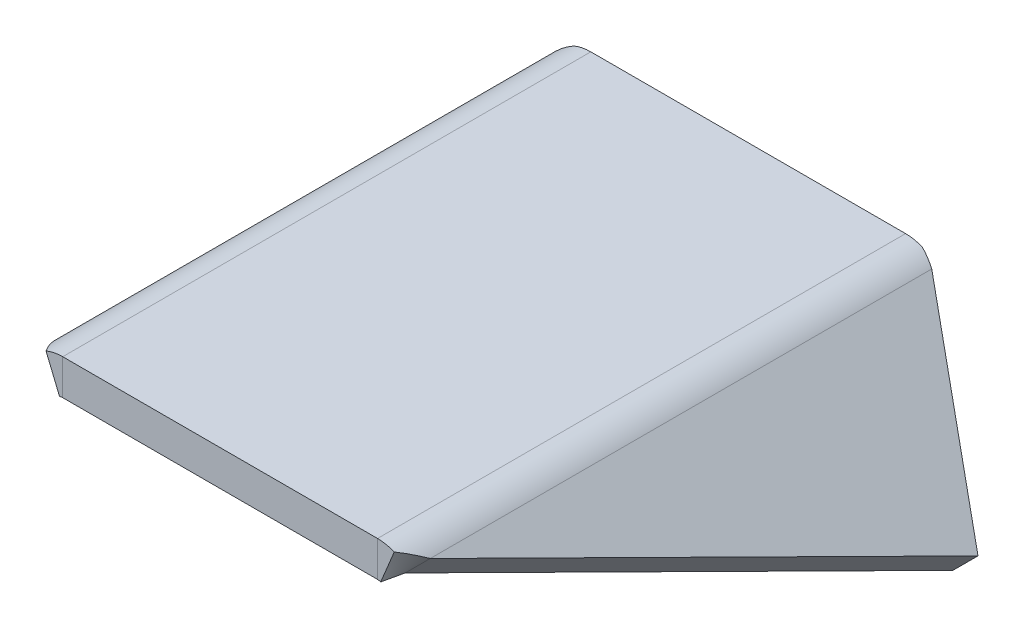
ISO-10303-21;
HEADER;
FILE_DESCRIPTION(('STEP AP214'),'2;1');
FILE_NAME('part.step','',(''),(''),'','','');
FILE_SCHEMA(('AUTOMOTIVE_DESIGN { 1 0 10303 214 1 1 1 1 }'));
ENDSEC;
DATA;
#1=APPLICATION_CONTEXT('core data for automotive mechanical design processes');
#2=APPLICATION_PROTOCOL_DEFINITION('international standard','automotive_design',2000,#1);
#3=PRODUCT_CONTEXT('',#1,'mechanical');
#4=PRODUCT('Part','Part','',(#3));
#5=PRODUCT_RELATED_PRODUCT_CATEGORY('part','',(#4));
#6=PRODUCT_DEFINITION_FORMATION('','',#4);
#7=PRODUCT_DEFINITION_CONTEXT('part definition',#1,'design');
#8=PRODUCT_DEFINITION('design','',#6,#7);
#9=PRODUCT_DEFINITION_SHAPE('','',#8);
#10=(LENGTH_UNIT() NAMED_UNIT(*) SI_UNIT(.MILLI.,.METRE.));
#11=(NAMED_UNIT(*) PLANE_ANGLE_UNIT() SI_UNIT($,.RADIAN.));
#12=(NAMED_UNIT(*) SI_UNIT($,.STERADIAN.) SOLID_ANGLE_UNIT());
#13=UNCERTAINTY_MEASURE_WITH_UNIT(LENGTH_MEASURE(1.E-05),#10,'distance_accuracy_value','');
#14=(GEOMETRIC_REPRESENTATION_CONTEXT(3) GLOBAL_UNCERTAINTY_ASSIGNED_CONTEXT((#13)) GLOBAL_UNIT_ASSIGNED_CONTEXT((#10,
#11,#12)) REPRESENTATION_CONTEXT('',''));
#15=CARTESIAN_POINT('',(0.,0.,0.));
#16=DIRECTION('',(0.,0.,1.));
#17=DIRECTION('',(1.,0.,0.));
#18=AXIS2_PLACEMENT_3D('',#15,#16,#17);
#19=CARTESIAN_POINT('',(0.,-3.175,0.));
#20=DIRECTION('',(0.,1.,0.));
#21=DIRECTION('',(0.,0.,1.));
#22=AXIS2_PLACEMENT_3D('',#19,#20,#21);
#23=PLANE('',#22);
#24=DIRECTION('',(-1.,0.,0.));
#25=VECTOR('',#24,1.);
#26=CARTESIAN_POINT('',(30.,-3.175,0.));
#27=LINE('',#26,#25);
#28=CARTESIAN_POINT('',(29.087328064224,-3.175,0.));
#29=VERTEX_POINT('',#28);
#30=CARTESIAN_POINT('',(0.912671935776005,-3.175,0.));
#31=VERTEX_POINT('',#30);
#32=EDGE_CURVE('E557',#29,#31,#27,.T.);
#33=ORIENTED_EDGE('',*,*,#32,.F.);
#34=DIRECTION('',(0.,0.,1.));
#35=VECTOR('',#34,1.);
#36=CARTESIAN_POINT('',(29.087328064224,-3.175,0.));
#37=LINE('',#36,#35);
#38=CARTESIAN_POINT('',(29.087328064224,-3.175,47.26));
#39=VERTEX_POINT('',#38);
#40=EDGE_CURVE('E429',#29,#39,#37,.T.);
#41=ORIENTED_EDGE('',*,*,#40,.T.);
#42=DIRECTION('',(1.,0.,0.));
#43=VECTOR('',#42,1.);
#44=CARTESIAN_POINT('',(0.,-3.175,47.26));
#45=LINE('',#44,#43);
#46=CARTESIAN_POINT('',(0.912671935776006,-3.175,47.26));
#47=VERTEX_POINT('',#46);
#48=EDGE_CURVE('E717',#47,#39,#45,.T.);
#49=ORIENTED_EDGE('',*,*,#48,.F.);
#50=DIRECTION('',(0.,0.,1.));
#51=VECTOR('',#50,1.);
#52=CARTESIAN_POINT('',(0.912671935776007,-3.175,0.));
#53=LINE('',#52,#51);
#54=EDGE_CURVE('E549',#31,#47,#53,.T.);
#55=ORIENTED_EDGE('',*,*,#54,.F.);
#56=EDGE_LOOP('',(#33,#41,#49,#55));
#57=FACE_BOUND('',#56,.T.);
#58=ADVANCED_FACE('F74',(#57),#23,.F.);
#59=CARTESIAN_POINT('',(0.,-3.175,47.26));
#60=DIRECTION('',(0.,0.,1.));
#61=DIRECTION('',(1.,0.,0.));
#62=AXIS2_PLACEMENT_3D('',#59,#60,#61);
#63=PLANE('',#62);
#64=DIRECTION('',(0.,-1.,0.));
#65=VECTOR('',#64,1.);
#66=CARTESIAN_POINT('',(29.087328064224,-3.175,47.26));
#67=LINE('',#66,#65);
#68=CARTESIAN_POINT('',(29.087328064224,0.,47.26));
#69=VERTEX_POINT('',#68);
#70=EDGE_CURVE('E12',#69,#39,#67,.T.);
#71=ORIENTED_EDGE('',*,*,#70,.F.);
#72=DIRECTION('',(1.,0.,0.));
#73=VECTOR('',#72,1.);
#74=CARTESIAN_POINT('',(0.,0.,47.26));
#75=LINE('',#74,#73);
#76=CARTESIAN_POINT('',(0.912671935776001,0.,47.26));
#77=VERTEX_POINT('',#76);
#78=EDGE_CURVE('E93',#77,#69,#75,.T.);
#79=ORIENTED_EDGE('',*,*,#78,.F.);
#80=DIRECTION('',(0.,-1.,0.));
#81=VECTOR('',#80,1.);
#82=CARTESIAN_POINT('',(0.912671935776007,-3.175,47.26));
#83=LINE('',#82,#81);
#84=EDGE_CURVE('E556',#77,#47,#83,.T.);
#85=ORIENTED_EDGE('',*,*,#84,.T.);
#86=ORIENTED_EDGE('',*,*,#48,.T.);
#87=EDGE_LOOP('',(#71,#79,#85,#86));
#88=FACE_BOUND('',#87,.T.);
#89=ADVANCED_FACE('F730',(#88),#63,.T.);
#90=CARTESIAN_POINT('',(30.,-3.175,0.));
#91=DIRECTION('',(0.,0.,-1.));
#92=DIRECTION('',(-1.,0.,0.));
#93=AXIS2_PLACEMENT_3D('',#90,#91,#92);
#94=PLANE('',#93);
#95=DIRECTION('',(0.,1.,0.));
#96=VECTOR('',#95,1.);
#97=CARTESIAN_POINT('',(29.087328064224,-3.175,0.));
#98=LINE('',#97,#96);
#99=CARTESIAN_POINT('',(29.087328064224,0.,0.));
#100=VERTEX_POINT('',#99);
#101=EDGE_CURVE('E714',#29,#100,#98,.T.);
#102=ORIENTED_EDGE('',*,*,#101,.F.);
#103=ORIENTED_EDGE('',*,*,#32,.T.);
#104=DIRECTION('',(0.,1.,0.));
#105=VECTOR('',#104,1.);
#106=CARTESIAN_POINT('',(0.912671935776006,-3.175,0.));
#107=LINE('',#106,#105);
#108=CARTESIAN_POINT('',(0.912671935776006,0.,0.));
#109=VERTEX_POINT('',#108);
#110=EDGE_CURVE('E562',#31,#109,#107,.T.);
#111=ORIENTED_EDGE('',*,*,#110,.T.);
#112=DIRECTION('',(-1.,0.,0.));
#113=VECTOR('',#112,1.);
#114=CARTESIAN_POINT('',(30.,0.,0.));
#115=LINE('',#114,#113);
#116=EDGE_CURVE('E101',#100,#109,#115,.T.);
#117=ORIENTED_EDGE('',*,*,#116,.F.);
#118=EDGE_LOOP('',(#102,#103,#111,#117));
#119=FACE_BOUND('',#118,.T.);
#120=ADVANCED_FACE('F508',(#119),#94,.T.);
#121=CARTESIAN_POINT('',(0.,0.,0.));
#122=DIRECTION('',(0.,1.,0.));
#123=DIRECTION('',(0.,0.,1.));
#124=AXIS2_PLACEMENT_3D('',#121,#122,#123);
#125=PLANE('',#124);
#126=DIRECTION('',(0.,0.,1.));
#127=VECTOR('',#126,1.);
#128=CARTESIAN_POINT('',(29.087328064224,0.,0.));
#129=LINE('',#128,#127);
#130=EDGE_CURVE('E85',#100,#69,#129,.T.);
#131=ORIENTED_EDGE('',*,*,#130,.F.);
#132=ORIENTED_EDGE('',*,*,#116,.T.);
#133=DIRECTION('',(0.,0.,1.));
#134=VECTOR('',#133,1.);
#135=CARTESIAN_POINT('',(0.912671935776007,0.,0.));
#136=LINE('',#135,#134);
#137=EDGE_CURVE('E560',#109,#77,#136,.T.);
#138=ORIENTED_EDGE('',*,*,#137,.T.);
#139=ORIENTED_EDGE('',*,*,#78,.T.);
#140=EDGE_LOOP('',(#131,#132,#138,#139));
#141=FACE_BOUND('',#140,.T.);
#142=ADVANCED_FACE('F76',(#141),#125,.T.);
#143=CARTESIAN_POINT('',(0.912671935776007,-3.9116,0.));
#144=DIRECTION('',(0.,0.,1.));
#145=DIRECTION('',(1.,0.,0.));
#146=AXIS2_PLACEMENT_3D('',#143,#144,#145);
#147=PLANE('',#146);
#148=CARTESIAN_POINT('',(-0.584232578263285,-0.297752820628853,0.));
#149=CARTESIAN_POINT('',(0.63078731949588,-3.23107033635219,0.));
#150=B_SPLINE_CURVE_WITH_KNOTS('',1,(#148,#149),.UNSPECIFIED.,.F.,.F.,(2,2),(0.,1.),.UNSPECIFIED.);
#151=CARTESIAN_POINT('',(-0.584232578263287,-0.297752820628854,0.));
#152=VERTEX_POINT('',#151);
#153=CARTESIAN_POINT('',(0.63078731949588,-3.23107033635219,0.));
#154=VERTEX_POINT('',#153);
#155=EDGE_CURVE('E537',#152,#154,#150,.T.);
#156=ORIENTED_EDGE('',*,*,#155,.F.);
#157=CARTESIAN_POINT('',(0.912671935776007,-3.9116,0.));
#158=DIRECTION('',(0.,0.,-1.));
#159=DIRECTION('',(-1.,0.,0.));
#160=AXIS2_PLACEMENT_3D('',#157,#158,#159);
#161=CIRCLE('',#160,3.9116);
#162=EDGE_CURVE('E611',#152,#109,#161,.T.);
#163=ORIENTED_EDGE('',*,*,#162,.T.);
#164=ORIENTED_EDGE('',*,*,#110,.F.);
#165=CARTESIAN_POINT('',(0.912671935776007,-3.9116,0.));
#166=DIRECTION('',(0.,0.,-1.));
#167=DIRECTION('',(1.,0.,0.));
#168=AXIS2_PLACEMENT_3D('',#165,#166,#167);
#169=CIRCLE('',#168,0.7366);
#170=EDGE_CURVE('E595',#154,#31,#169,.T.);
#171=ORIENTED_EDGE('',*,*,#170,.F.);
#172=EDGE_LOOP('',(#156,#163,#164,#171));
#173=FACE_BOUND('',#172,.T.);
#174=ADVANCED_FACE('F505',(#173),#147,.F.);
#175=CARTESIAN_POINT('',(0.912671935776007,-3.9116,47.26));
#176=DIRECTION('',(0.,0.,-1.));
#177=DIRECTION('',(-1.,0.,0.));
#178=AXIS2_PLACEMENT_3D('',#175,#176,#177);
#179=PLANE('',#178);
#180=ORIENTED_EDGE('',*,*,#84,.F.);
#181=CARTESIAN_POINT('',(0.912671935776007,-3.9116,47.26));
#182=DIRECTION('',(0.,0.,-1.));
#183=DIRECTION('',(-1.,0.,0.));
#184=AXIS2_PLACEMENT_3D('',#181,#182,#183);
#185=CIRCLE('',#184,3.9116);
#186=CARTESIAN_POINT('',(-0.584232578263276,-0.29775282062885,47.26));
#187=VERTEX_POINT('',#186);
#188=EDGE_CURVE('E604',#77,#187,#185,.F.);
#189=ORIENTED_EDGE('',*,*,#188,.T.);
#190=CARTESIAN_POINT('',(0.630787319495882,-3.23107033635219,47.26));
#191=CARTESIAN_POINT('',(-0.584232578263277,-0.29775282062885,47.26));
#192=B_SPLINE_CURVE_WITH_KNOTS('',1,(#190,#191),.UNSPECIFIED.,.F.,.F.,(2,2),(0.,1.),.UNSPECIFIED.);
#193=CARTESIAN_POINT('',(0.630787319495882,-3.23107033635219,47.26));
#194=VERTEX_POINT('',#193);
#195=EDGE_CURVE('E649',#187,#194,#192,.F.);
#196=ORIENTED_EDGE('',*,*,#195,.T.);
#197=CARTESIAN_POINT('',(0.912671935776007,-3.9116,47.26));
#198=DIRECTION('',(0.,0.,1.));
#199=DIRECTION('',(-1.,0.,0.));
#200=AXIS2_PLACEMENT_3D('',#197,#198,#199);
#201=CIRCLE('',#200,0.7366);
#202=EDGE_CURVE('E591',#47,#194,#201,.T.);
#203=ORIENTED_EDGE('',*,*,#202,.F.);
#204=EDGE_LOOP('',(#180,#189,#196,#203));
#205=FACE_BOUND('',#204,.T.);
#206=ADVANCED_FACE('F626',(#205),#179,.F.);
#207=CARTESIAN_POINT('',(-0.584232578263277,-0.29775282062885,47.26));
#208=CARTESIAN_POINT('',(-1.05740414577732,-0.493746901222502,46.6074239666691));
#209=CARTESIAN_POINT('',(-1.49109711040561,-0.783531275603014,45.9553447509044));
#210=CARTESIAN_POINT('',(-1.8532469495133,-1.14568111471071,45.3027687175734));
#211=CARTESIAN_POINT('',(0.630787319495882,-3.23107033635219,47.26));
#212=CARTESIAN_POINT('',(0.541704822515666,-3.26796951477145,46.6075795219631));
#213=CARTESIAN_POINT('',(0.459997872170077,-3.32256435356191,45.9551891956104));
#214=CARTESIAN_POINT('',(0.391817080753995,-3.39074514497799,45.3027687175734));
#215=B_SPLINE_SURFACE_WITH_KNOTS('',1,3,((#207,#208,#209,#210),(#211,#212,#213,#214)),
.UNSPECIFIED.,.F.,.F.,.F.,(2,2),(4,4),(0.,1.),(0.,1.),.UNSPECIFIED.);
#216=CARTESIAN_POINT('',(-0.584232578263277,-0.29775282062885,47.26));
#217=CARTESIAN_POINT('',(-1.05740414577732,-0.493746901222502,46.6074239666691));
#218=CARTESIAN_POINT('',(-1.49109711040561,-0.783531275603014,45.9553447509044));
#219=CARTESIAN_POINT('',(-1.8532469495133,-1.14568111471071,45.3027687175734));
#220=B_SPLINE_CURVE_WITH_KNOTS('',3,(#216,#217,#218,#219),.UNSPECIFIED.,.F.,.F.,(4,4),(0.,1.),.UNSPECIFIED.);
#221=CARTESIAN_POINT('',(-1.8532469495133,-1.14568111471071,45.3027687175734));
#222=VERTEX_POINT('',#221);
#223=EDGE_CURVE('E586',#187,#222,#220,.T.);
#224=CARTESIAN_POINT('',(-1.8532469495133,-1.14568111471071,45.3027687175734));
#225=CARTESIAN_POINT('',(0.391817080753995,-3.39074514497799,45.3027687175734));
#226=B_SPLINE_CURVE_WITH_KNOTS('',1,(#224,#225),.UNSPECIFIED.,.F.,.F.,(2,2),(0.,1.),.UNSPECIFIED.);
#227=CARTESIAN_POINT('',(0.391817080753996,-3.39074514497799,45.3027687175734));
#228=VERTEX_POINT('',#227);
#229=EDGE_CURVE('E408',#222,#228,#226,.T.);
#230=CARTESIAN_POINT('',(0.391817080753995,-3.39074514497799,45.3027687175734));
#231=CARTESIAN_POINT('',(0.459997872170077,-3.32256435356191,45.9551891956104));
#232=CARTESIAN_POINT('',(0.541704822515666,-3.26796951477145,46.6075795219631));
#233=CARTESIAN_POINT('',(0.630787319495882,-3.23107033635219,47.26));
#234=B_SPLINE_CURVE_WITH_KNOTS('',3,(#230,#231,#232,#233),.UNSPECIFIED.,.F.,.F.,(4,4),(0.,1.),.UNSPECIFIED.);
#235=EDGE_CURVE('E583',#194,#228,#234,.F.);
#236=ORIENTED_EDGE('',*,*,#195,.F.);
#237=ORIENTED_EDGE('',*,*,#223,.T.);
#238=ORIENTED_EDGE('',*,*,#229,.T.);
#239=ORIENTED_EDGE('',*,*,#235,.F.);
#240=EDGE_LOOP('',(#236,#237,#238,#239));
#241=FACE_BOUND('',#240,.T.);
#242=ADVANCED_FACE('F504',(#241),#215,.F.);
#243=CARTESIAN_POINT('',(-1.8532469495133,-1.14568111471071,0.425585913035487));
#244=CARTESIAN_POINT('',(-1.49098829922005,-0.783422464417457,0.283645297689269));
#245=CARTESIAN_POINT('',(-1.05754631444255,-0.493805789411785,0.141940615346218));
#246=CARTESIAN_POINT('',(-0.584232578263285,-0.297752820628853,0.));
#247=CARTESIAN_POINT('',(0.391817080753995,-3.39074514497799,0.425585913035487));
#248=CARTESIAN_POINT('',(0.460011369199545,-3.32255085653244,0.283693673255944));
#249=CARTESIAN_POINT('',(0.541687187796827,-3.26797681931116,0.141892239779543));
#250=CARTESIAN_POINT('',(0.63078731949588,-3.23107033635219,0.));
#251=B_SPLINE_SURFACE_WITH_KNOTS('',1,3,((#243,#244,#245,#246),(#247,#248,#249,#250)),
.UNSPECIFIED.,.F.,.F.,.F.,(2,2),(4,4),(0.,1.),(0.,1.),.UNSPECIFIED.);
#252=CARTESIAN_POINT('',(-1.8532469495133,-1.14568111471071,0.425585913035487));
#253=CARTESIAN_POINT('',(-1.49098829922005,-0.783422464417457,0.283645297689269));
#254=CARTESIAN_POINT('',(-1.05754631444255,-0.493805789411785,0.141940615346218));
#255=CARTESIAN_POINT('',(-0.584232578263285,-0.297752820628853,0.));
#256=B_SPLINE_CURVE_WITH_KNOTS('',3,(#252,#253,#254,#255),.UNSPECIFIED.,.F.,.F.,(4,4),(0.,1.),.UNSPECIFIED.);
#257=CARTESIAN_POINT('',(-1.8532469495133,-1.14568111471071,0.425585913035492));
#258=VERTEX_POINT('',#257);
#259=EDGE_CURVE('E477',#258,#152,#256,.T.);
#260=CARTESIAN_POINT('',(0.63078731949588,-3.23107033635219,0.));
#261=CARTESIAN_POINT('',(0.541687187796827,-3.26797681931116,0.141892239779543));
#262=CARTESIAN_POINT('',(0.460011369199545,-3.32255085653244,0.283693673255944));
#263=CARTESIAN_POINT('',(0.391817080753995,-3.39074514497799,0.425585913035487));
#264=B_SPLINE_CURVE_WITH_KNOTS('',3,(#260,#261,#262,#263),.UNSPECIFIED.,.F.,.F.,(4,4),(0.,1.),.UNSPECIFIED.);
#265=CARTESIAN_POINT('',(0.391817080753995,-3.39074514497799,0.425585913035487));
#266=VERTEX_POINT('',#265);
#267=EDGE_CURVE('E471',#266,#154,#264,.F.);
#268=CARTESIAN_POINT('',(0.391817080753995,-3.39074514497799,0.425585913035487));
#269=CARTESIAN_POINT('',(-1.8532469495133,-1.14568111471071,0.425585913035487));
#270=B_SPLINE_CURVE_WITH_KNOTS('',1,(#268,#269),.UNSPECIFIED.,.F.,.F.,(2,2),(0.,1.),.UNSPECIFIED.);
#271=EDGE_CURVE('E409',#266,#258,#270,.T.);
#272=ORIENTED_EDGE('',*,*,#259,.T.);
#273=ORIENTED_EDGE('',*,*,#155,.T.);
#274=ORIENTED_EDGE('',*,*,#267,.F.);
#275=ORIENTED_EDGE('',*,*,#271,.T.);
#276=EDGE_LOOP('',(#272,#273,#274,#275));
#277=FACE_BOUND('',#276,.T.);
#278=ADVANCED_FACE('F444',(#277),#251,.F.);
#279=CARTESIAN_POINT('',(0.912671935776007,-3.9116,71.0316888438525));
#280=DIRECTION('',(0.,0.,-1.));
#281=DIRECTION('',(-1.,0.,0.));
#282=AXIS2_PLACEMENT_3D('',#279,#280,#281);
#283=CYLINDRICAL_SURFACE('',#282,0.7366);
#284=DIRECTION('',(0.,0.,1.));
#285=VECTOR('',#284,1.);
#286=CARTESIAN_POINT('',(0.391817080753997,-3.39074514497799,0.));
#287=LINE('',#286,#285);
#288=EDGE_CURVE('E568',#266,#228,#287,.T.);
#289=ORIENTED_EDGE('',*,*,#288,.F.);
#290=ORIENTED_EDGE('',*,*,#267,.T.);
#291=ORIENTED_EDGE('',*,*,#170,.T.);
#292=ORIENTED_EDGE('',*,*,#54,.T.);
#293=ORIENTED_EDGE('',*,*,#202,.T.);
#294=ORIENTED_EDGE('',*,*,#235,.T.);
#295=EDGE_LOOP('',(#289,#290,#291,#292,#293,#294));
#296=FACE_BOUND('',#295,.T.);
#297=ADVANCED_FACE('F440',(#296),#283,.F.);
#298=CARTESIAN_POINT('',(0.912671935776007,-3.9116,71.0316888438525));
#299=DIRECTION('',(0.,0.,-1.));
#300=DIRECTION('',(-1.,0.,0.));
#301=AXIS2_PLACEMENT_3D('',#298,#299,#300);
#302=CYLINDRICAL_SURFACE('',#301,3.9116);
#303=DIRECTION('',(0.,0.,1.));
#304=VECTOR('',#303,1.);
#305=CARTESIAN_POINT('',(-1.8532469495133,-1.1456811147107,0.));
#306=LINE('',#305,#304);
#307=EDGE_CURVE('E400',#258,#222,#306,.T.);
#308=ORIENTED_EDGE('',*,*,#307,.T.);
#309=ORIENTED_EDGE('',*,*,#223,.F.);
#310=ORIENTED_EDGE('',*,*,#188,.F.);
#311=ORIENTED_EDGE('',*,*,#137,.F.);
#312=ORIENTED_EDGE('',*,*,#162,.F.);
#313=ORIENTED_EDGE('',*,*,#259,.F.);
#314=EDGE_LOOP('',(#308,#309,#310,#311,#312,#313));
#315=FACE_BOUND('',#314,.T.);
#316=ADVANCED_FACE('F385',(#315),#302,.T.);
#317=CARTESIAN_POINT('',(1.03717359553986,-2.74538863019212,0.));
#318=DIRECTION('',(-0.707106781186549,0.707106781186546,0.));
#319=DIRECTION('',(0.,0.,1.));
#320=AXIS2_PLACEMENT_3D('',#317,#318,#319);
#321=PLANE('',#320);
#322=DIRECTION('',(-0.640856382055789,-0.640856382055792,0.422618261740694));
#323=VECTOR('',#322,1.);
#324=CARTESIAN_POINT('',(-11.7626118629775,-15.5451740887096,8.44092878310685));
#325=LINE('',#324,#323);
#326=CARTESIAN_POINT('',(-11.7626118629775,-15.5451740887096,8.44092878310685));
#327=VERTEX_POINT('',#326);
#328=EDGE_CURVE('E414',#266,#327,#325,.T.);
#329=ORIENTED_EDGE('',*,*,#328,.F.);
#330=ORIENTED_EDGE('',*,*,#288,.T.);
#331=DIRECTION('',(0.298836238730115,0.298836238730116,0.906307787036652));
#332=VECTOR('',#331,1.);
#333=CARTESIAN_POINT('',(1.03717359553987,-2.74538863019212,47.26));
#334=LINE('',#333,#332);
#335=EDGE_CURVE('E419',#327,#228,#334,.T.);
#336=ORIENTED_EDGE('',*,*,#335,.F.);
#337=EDGE_LOOP('',(#329,#330,#336));
#338=FACE_BOUND('',#337,.T.);
#339=ADVANCED_FACE('F381',(#338),#321,.F.);
#340=CARTESIAN_POINT('',(1.03717359553987,-2.74538863019212,47.26));
#341=DIRECTION('',(-0.640856382055789,-0.640856382055792,0.422618261740694));
#342=DIRECTION('',(0.298836238730115,0.298836238730116,0.906307787036653));
#343=AXIS2_PLACEMENT_3D('',#340,#341,#342);
#344=PLANE('',#343);
#345=ORIENTED_EDGE('',*,*,#229,.F.);
#346=DIRECTION('',(0.298836238730115,0.298836238730116,0.906307787036652));
#347=VECTOR('',#346,1.);
#348=CARTESIAN_POINT('',(-1.20789043472743,-0.500324599924833,47.26));
#349=LINE('',#348,#347);
#350=CARTESIAN_POINT('',(-14.0076758932448,-13.3001100584423,8.44092878310685));
#351=VERTEX_POINT('',#350);
#352=EDGE_CURVE('E412',#351,#222,#349,.T.);
#353=ORIENTED_EDGE('',*,*,#352,.F.);
#354=DIRECTION('',(-0.707106781186549,0.707106781186546,0.));
#355=VECTOR('',#354,1.);
#356=CARTESIAN_POINT('',(-11.7626118629775,-15.5451740887096,8.44092878310685));
#357=LINE('',#356,#355);
#358=EDGE_CURVE('E565',#327,#351,#357,.T.);
#359=ORIENTED_EDGE('',*,*,#358,.F.);
#360=ORIENTED_EDGE('',*,*,#335,.T.);
#361=EDGE_LOOP('',(#345,#353,#359,#360));
#362=FACE_BOUND('',#361,.T.);
#363=ADVANCED_FACE('F384',(#362),#344,.T.);
#364=CARTESIAN_POINT('',(-1.20789043472743,-0.500324599924838,0.));
#365=DIRECTION('',(-0.707106781186549,0.707106781186546,0.));
#366=DIRECTION('',(0.,0.,1.));
#367=AXIS2_PLACEMENT_3D('',#364,#365,#366);
#368=PLANE('',#367);
#369=ORIENTED_EDGE('',*,*,#307,.F.);
#370=DIRECTION('',(-0.640856382055789,-0.640856382055792,0.422618261740694));
#371=VECTOR('',#370,1.);
#372=CARTESIAN_POINT('',(-14.0076758932448,-13.3001100584423,8.44092878310685));
#373=LINE('',#372,#371);
#374=EDGE_CURVE('E415',#258,#351,#373,.T.);
#375=ORIENTED_EDGE('',*,*,#374,.T.);
#376=ORIENTED_EDGE('',*,*,#352,.T.);
#377=EDGE_LOOP('',(#369,#375,#376));
#378=FACE_BOUND('',#377,.T.);
#379=ADVANCED_FACE('F390',(#378),#368,.T.);
#380=CARTESIAN_POINT('',(-11.7626118629775,-15.5451740887096,8.44092878310685));
#381=DIRECTION('',(-0.298836238730115,-0.298836238730116,-0.906307787036652));
#382=DIRECTION('',(-0.640856382055789,-0.640856382055792,0.422618261740694));
#383=AXIS2_PLACEMENT_3D('',#380,#381,#382);
#384=PLANE('',#383);
#385=ORIENTED_EDGE('',*,*,#271,.F.);
#386=ORIENTED_EDGE('',*,*,#328,.T.);
#387=ORIENTED_EDGE('',*,*,#358,.T.);
#388=ORIENTED_EDGE('',*,*,#374,.F.);
#389=EDGE_LOOP('',(#385,#386,#387,#388));
#390=FACE_BOUND('',#389,.T.);
#391=ADVANCED_FACE('F431',(#390),#384,.T.);
#392=CARTESIAN_POINT('',(30.5842325782633,-0.297752820628848,0.));
#393=CARTESIAN_POINT('',(31.0575463144425,-0.493805789411776,0.141940615346219));
#394=CARTESIAN_POINT('',(31.4909882992201,-0.783422464417472,0.283645297689285));
#395=CARTESIAN_POINT('',(31.8532469495133,-1.14568111471071,0.425585913035501));
#396=CARTESIAN_POINT('',(29.3692126805041,-3.23107033635219,0.));
#397=CARTESIAN_POINT('',(29.4583128122032,-3.26797681931117,0.14189223977956));
#398=CARTESIAN_POINT('',(29.5399886308005,-3.32255085653244,0.283693673255946));
#399=CARTESIAN_POINT('',(29.608182919246,-3.39074514497799,0.425585913035501));
#400=B_SPLINE_SURFACE_WITH_KNOTS('',1,3,((#392,#393,#394,#395),(#396,#397,#398,#399)),
.UNSPECIFIED.,.F.,.F.,.F.,(2,2),(4,4),(0.,1.),(0.,1.),.UNSPECIFIED.);
#401=CARTESIAN_POINT('',(29.3692126805041,-3.23107033635219,0.));
#402=CARTESIAN_POINT('',(30.5842325782633,-0.297752820628848,0.));
#403=B_SPLINE_CURVE_WITH_KNOTS('',1,(#401,#402),.UNSPECIFIED.,.F.,.F.,(2,2),(0.,1.),.UNSPECIFIED.);
#404=CARTESIAN_POINT('',(30.5842325782633,-0.297752820628848,0.));
#405=VERTEX_POINT('',#404);
#406=CARTESIAN_POINT('',(29.3692126805041,-3.23107033635219,0.));
#407=VERTEX_POINT('',#406);
#408=EDGE_CURVE('E368',#405,#407,#403,.F.);
#409=CARTESIAN_POINT('',(30.5842325782633,-0.297752820628848,0.));
#410=CARTESIAN_POINT('',(31.0575463144425,-0.493805789411776,0.141940615346219));
#411=CARTESIAN_POINT('',(31.4909882992201,-0.783422464417472,0.283645297689285));
#412=CARTESIAN_POINT('',(31.8532469495133,-1.14568111471071,0.425585913035501));
#413=B_SPLINE_CURVE_WITH_KNOTS('',3,(#409,#410,#411,#412),.UNSPECIFIED.,.F.,.F.,(4,4),(0.,1.),.UNSPECIFIED.);
#414=CARTESIAN_POINT('',(31.8532469495133,-1.1456811147107,0.425585913035501));
#415=VERTEX_POINT('',#414);
#416=EDGE_CURVE('E199',#405,#415,#413,.T.);
#417=CARTESIAN_POINT('',(31.8532469495133,-1.14568111471071,0.425585913035501));
#418=CARTESIAN_POINT('',(29.608182919246,-3.39074514497799,0.425585913035501));
#419=B_SPLINE_CURVE_WITH_KNOTS('',1,(#417,#418),.UNSPECIFIED.,.F.,.F.,(2,2),(0.,1.),.UNSPECIFIED.);
#420=CARTESIAN_POINT('',(29.608182919246,-3.39074514497799,0.425585913035501));
#421=VERTEX_POINT('',#420);
#422=EDGE_CURVE('E203',#421,#415,#419,.F.);
#423=CARTESIAN_POINT('',(29.608182919246,-3.39074514497799,0.425585913035501));
#424=CARTESIAN_POINT('',(29.5399886308005,-3.32255085653244,0.283693673255946));
#425=CARTESIAN_POINT('',(29.4583128122032,-3.26797681931117,0.14189223977956));
#426=CARTESIAN_POINT('',(29.3692126805041,-3.23107033635219,0.));
#427=B_SPLINE_CURVE_WITH_KNOTS('',3,(#423,#424,#425,#426),.UNSPECIFIED.,.F.,.F.,(4,4),(0.,1.),.UNSPECIFIED.);
#428=EDGE_CURVE('E669',#407,#421,#427,.F.);
#429=ORIENTED_EDGE('',*,*,#408,.F.);
#430=ORIENTED_EDGE('',*,*,#416,.T.);
#431=ORIENTED_EDGE('',*,*,#422,.F.);
#432=ORIENTED_EDGE('',*,*,#428,.F.);
#433=EDGE_LOOP('',(#429,#430,#431,#432));
#434=FACE_BOUND('',#433,.T.);
#435=ADVANCED_FACE('F303',(#434),#400,.F.);
#436=CARTESIAN_POINT('',(31.8532469495133,-1.14568111471073,45.3027687175735));
#437=CARTESIAN_POINT('',(31.4910971104056,-0.783531275603021,45.9553447509044));
#438=CARTESIAN_POINT('',(31.0574041457774,-0.493746901222518,46.6074239666691));
#439=CARTESIAN_POINT('',(30.5842325782633,-0.297752820628855,47.26));
#440=CARTESIAN_POINT('',(29.608182919246,-3.39074514497799,45.3027687175735));
#441=CARTESIAN_POINT('',(29.5400021278299,-3.3225643535619,45.9551891956104));
#442=CARTESIAN_POINT('',(29.4582951774843,-3.26796951477145,46.6075795219631));
#443=CARTESIAN_POINT('',(29.3692126805041,-3.23107033635219,47.26));
#444=B_SPLINE_SURFACE_WITH_KNOTS('',1,3,((#436,#437,#438,#439),(#440,#441,#442,#443)),
.UNSPECIFIED.,.F.,.F.,.F.,(2,2),(4,4),(0.,1.),(0.,1.),.UNSPECIFIED.);
#445=CARTESIAN_POINT('',(29.608182919246,-3.39074514497799,45.3027687175735));
#446=CARTESIAN_POINT('',(31.8532469495133,-1.14568111471073,45.3027687175735));
#447=B_SPLINE_CURVE_WITH_KNOTS('',1,(#445,#446),.UNSPECIFIED.,.F.,.F.,(2,2),(0.,1.),.UNSPECIFIED.);
#448=CARTESIAN_POINT('',(31.8532469495133,-1.1456811147107,45.3027687175735));
#449=VERTEX_POINT('',#448);
#450=CARTESIAN_POINT('',(29.608182919246,-3.39074514497799,45.3027687175735));
#451=VERTEX_POINT('',#450);
#452=EDGE_CURVE('E187',#449,#451,#447,.F.);
#453=CARTESIAN_POINT('',(31.8532469495133,-1.14568111471073,45.3027687175735));
#454=CARTESIAN_POINT('',(31.4910971104056,-0.783531275603021,45.9553447509044));
#455=CARTESIAN_POINT('',(31.0574041457774,-0.493746901222518,46.6074239666691));
#456=CARTESIAN_POINT('',(30.5842325782633,-0.297752820628855,47.26));
#457=B_SPLINE_CURVE_WITH_KNOTS('',3,(#453,#454,#455,#456),.UNSPECIFIED.,.F.,.F.,(4,4),(0.,1.),.UNSPECIFIED.);
#458=CARTESIAN_POINT('',(30.5842325782633,-0.297752820628855,47.26));
#459=VERTEX_POINT('',#458);
#460=EDGE_CURVE('E276',#449,#459,#457,.T.);
#461=CARTESIAN_POINT('',(30.5842325782633,-0.297752820628855,47.26));
#462=CARTESIAN_POINT('',(29.3692126805041,-3.23107033635219,47.26));
#463=B_SPLINE_CURVE_WITH_KNOTS('',1,(#461,#462),.UNSPECIFIED.,.F.,.F.,(2,2),(0.,1.),.UNSPECIFIED.);
#464=CARTESIAN_POINT('',(29.3692126805041,-3.23107033635219,47.26));
#465=VERTEX_POINT('',#464);
#466=EDGE_CURVE('E334',#459,#465,#463,.T.);
#467=CARTESIAN_POINT('',(29.3692126805041,-3.23107033635219,47.26));
#468=CARTESIAN_POINT('',(29.4582951774843,-3.26796951477145,46.6075795219631));
#469=CARTESIAN_POINT('',(29.5400021278299,-3.3225643535619,45.9551891956104));
#470=CARTESIAN_POINT('',(29.608182919246,-3.39074514497799,45.3027687175735));
#471=B_SPLINE_CURVE_WITH_KNOTS('',3,(#467,#468,#469,#470),.UNSPECIFIED.,.F.,.F.,(4,4),(0.,1.),.UNSPECIFIED.);
#472=EDGE_CURVE('E268',#451,#465,#471,.F.);
#473=ORIENTED_EDGE('',*,*,#452,.F.);
#474=ORIENTED_EDGE('',*,*,#460,.T.);
#475=ORIENTED_EDGE('',*,*,#466,.T.);
#476=ORIENTED_EDGE('',*,*,#472,.F.);
#477=EDGE_LOOP('',(#473,#474,#475,#476));
#478=FACE_BOUND('',#477,.T.);
#479=ADVANCED_FACE('F291',(#478),#444,.F.);
#480=CARTESIAN_POINT('',(29.087328064224,-3.9116,47.26));
#481=DIRECTION('',(0.,0.,-1.));
#482=DIRECTION('',(-1.,0.,0.));
#483=AXIS2_PLACEMENT_3D('',#480,#481,#482);
#484=PLANE('',#483);
#485=ORIENTED_EDGE('',*,*,#466,.F.);
#486=CARTESIAN_POINT('',(29.087328064224,-3.9116,47.26));
#487=DIRECTION('',(0.,0.,1.));
#488=DIRECTION('',(1.,0.,0.));
#489=AXIS2_PLACEMENT_3D('',#486,#487,#488);
#490=CIRCLE('',#489,3.9116);
#491=EDGE_CURVE('E693',#459,#69,#490,.T.);
#492=ORIENTED_EDGE('',*,*,#491,.T.);
#493=ORIENTED_EDGE('',*,*,#70,.T.);
#494=CARTESIAN_POINT('',(29.087328064224,-3.9116,47.26));
#495=DIRECTION('',(0.,0.,1.));
#496=DIRECTION('',(-1.,0.,0.));
#497=AXIS2_PLACEMENT_3D('',#494,#495,#496);
#498=CIRCLE('',#497,0.7366);
#499=EDGE_CURVE('E256',#465,#39,#498,.T.);
#500=ORIENTED_EDGE('',*,*,#499,.F.);
#501=EDGE_LOOP('',(#485,#492,#493,#500));
#502=FACE_BOUND('',#501,.T.);
#503=ADVANCED_FACE('F302',(#502),#484,.F.);
#504=CARTESIAN_POINT('',(29.087328064224,-3.9116,0.));
#505=DIRECTION('',(0.,0.,1.));
#506=DIRECTION('',(1.,0.,0.));
#507=AXIS2_PLACEMENT_3D('',#504,#505,#506);
#508=PLANE('',#507);
#509=CARTESIAN_POINT('',(29.087328064224,-3.9116,0.));
#510=DIRECTION('',(0.,0.,1.));
#511=DIRECTION('',(1.,0.,0.));
#512=AXIS2_PLACEMENT_3D('',#509,#510,#511);
#513=CIRCLE('',#512,3.9116);
#514=EDGE_CURVE('E672',#100,#405,#513,.F.);
#515=ORIENTED_EDGE('',*,*,#514,.T.);
#516=ORIENTED_EDGE('',*,*,#408,.T.);
#517=CARTESIAN_POINT('',(29.087328064224,-3.9116,0.));
#518=DIRECTION('',(0.,0.,-1.));
#519=DIRECTION('',(1.,0.,0.));
#520=AXIS2_PLACEMENT_3D('',#517,#518,#519);
#521=CIRCLE('',#520,0.7366);
#522=EDGE_CURVE('E674',#29,#407,#521,.T.);
#523=ORIENTED_EDGE('',*,*,#522,.F.);
#524=ORIENTED_EDGE('',*,*,#101,.T.);
#525=EDGE_LOOP('',(#515,#516,#523,#524));
#526=FACE_BOUND('',#525,.T.);
#527=ADVANCED_FACE('F239',(#526),#508,.F.);
#528=CARTESIAN_POINT('',(29.087328064224,-3.9116,-23.7716888438525));
#529=DIRECTION('',(0.,0.,1.));
#530=DIRECTION('',(1.,0.,0.));
#531=AXIS2_PLACEMENT_3D('',#528,#529,#530);
#532=CYLINDRICAL_SURFACE('',#531,0.7366);
#533=ORIENTED_EDGE('',*,*,#40,.F.);
#534=ORIENTED_EDGE('',*,*,#522,.T.);
#535=ORIENTED_EDGE('',*,*,#428,.T.);
#536=DIRECTION('',(0.,0.,1.));
#537=VECTOR('',#536,1.);
#538=CARTESIAN_POINT('',(29.608182919246,-3.39074514497799,0.));
#539=LINE('',#538,#537);
#540=EDGE_CURVE('E202',#421,#451,#539,.T.);
#541=ORIENTED_EDGE('',*,*,#540,.T.);
#542=ORIENTED_EDGE('',*,*,#472,.T.);
#543=ORIENTED_EDGE('',*,*,#499,.T.);
#544=EDGE_LOOP('',(#533,#534,#535,#541,#542,#543));
#545=FACE_BOUND('',#544,.T.);
#546=ADVANCED_FACE('F234',(#545),#532,.F.);
#547=CARTESIAN_POINT('',(29.087328064224,-3.9116,-23.7716888438525));
#548=DIRECTION('',(0.,0.,1.));
#549=DIRECTION('',(1.,0.,0.));
#550=AXIS2_PLACEMENT_3D('',#547,#548,#549);
#551=CYLINDRICAL_SURFACE('',#550,3.9116);
#552=ORIENTED_EDGE('',*,*,#130,.T.);
#553=ORIENTED_EDGE('',*,*,#491,.F.);
#554=ORIENTED_EDGE('',*,*,#460,.F.);
#555=DIRECTION('',(0.,0.,1.));
#556=VECTOR('',#555,1.);
#557=CARTESIAN_POINT('',(31.8532469495133,-1.1456811147107,0.));
#558=LINE('',#557,#556);
#559=EDGE_CURVE('E217',#415,#449,#558,.T.);
#560=ORIENTED_EDGE('',*,*,#559,.F.);
#561=ORIENTED_EDGE('',*,*,#416,.F.);
#562=ORIENTED_EDGE('',*,*,#514,.F.);
#563=EDGE_LOOP('',(#552,#553,#554,#560,#561,#562));
#564=FACE_BOUND('',#563,.T.);
#565=ADVANCED_FACE('F238',(#564),#551,.T.);
#566=CARTESIAN_POINT('',(7.74962296886375,18.4678148054043,0.));
#567=DIRECTION('',(0.707106781186549,0.707106781186546,0.));
#568=DIRECTION('',(0.,0.,1.));
#569=AXIS2_PLACEMENT_3D('',#566,#567,#568);
#570=PLANE('',#569);
#571=ORIENTED_EDGE('',*,*,#540,.F.);
#572=DIRECTION('',(-0.640856382055787,0.64085638205579,-0.4226182617407));
#573=VECTOR('',#572,1.);
#574=CARTESIAN_POINT('',(41.7626118629777,-15.5451740887097,8.4409287831071));
#575=LINE('',#574,#573);
#576=CARTESIAN_POINT('',(41.7626118629777,-15.5451740887097,8.4409287831071));
#577=VERTEX_POINT('',#576);
#578=EDGE_CURVE('E196',#577,#421,#575,.T.);
#579=ORIENTED_EDGE('',*,*,#578,.F.);
#580=DIRECTION('',(0.29883623873012,-0.298836238730121,-0.90630778703665));
#581=VECTOR('',#580,1.);
#582=CARTESIAN_POINT('',(28.9628264044601,-2.74538863019212,47.26));
#583=LINE('',#582,#581);
#584=EDGE_CURVE('E181',#451,#577,#583,.T.);
#585=ORIENTED_EDGE('',*,*,#584,.F.);
#586=EDGE_LOOP('',(#571,#579,#585));
#587=FACE_BOUND('',#586,.T.);
#588=ADVANCED_FACE('F201',(#587),#570,.F.);
#589=CARTESIAN_POINT('',(41.7626118629777,-15.5451740887097,8.4409287831071));
#590=DIRECTION('',(0.29883623873012,-0.298836238730121,-0.90630778703665));
#591=DIRECTION('',(-0.640856382055787,0.64085638205579,-0.4226182617407));
#592=AXIS2_PLACEMENT_3D('',#589,#590,#591);
#593=PLANE('',#592);
#594=ORIENTED_EDGE('',*,*,#578,.T.);
#595=ORIENTED_EDGE('',*,*,#422,.T.);
#596=DIRECTION('',(-0.640856382055787,0.64085638205579,-0.4226182617407));
#597=VECTOR('',#596,1.);
#598=CARTESIAN_POINT('',(44.007675893245,-13.3001100584424,8.4409287831071));
#599=LINE('',#598,#597);
#600=CARTESIAN_POINT('',(44.007675893245,-13.3001100584424,8.4409287831071));
#601=VERTEX_POINT('',#600);
#602=EDGE_CURVE('E198',#601,#415,#599,.T.);
#603=ORIENTED_EDGE('',*,*,#602,.F.);
#604=DIRECTION('',(0.707106781186549,0.707106781186546,0.));
#605=VECTOR('',#604,1.);
#606=CARTESIAN_POINT('',(41.7626118629777,-15.5451740887097,8.4409287831071));
#607=LINE('',#606,#605);
#608=EDGE_CURVE('E184',#577,#601,#607,.T.);
#609=ORIENTED_EDGE('',*,*,#608,.F.);
#610=EDGE_LOOP('',(#594,#595,#603,#609));
#611=FACE_BOUND('',#610,.T.);
#612=ADVANCED_FACE('F194',(#611),#593,.T.);
#613=CARTESIAN_POINT('',(9.99468699913104,20.7128788356716,0.));
#614=DIRECTION('',(0.707106781186549,0.707106781186546,0.));
#615=DIRECTION('',(0.,0.,1.));
#616=AXIS2_PLACEMENT_3D('',#613,#614,#615);
#617=PLANE('',#616);
#618=ORIENTED_EDGE('',*,*,#602,.T.);
#619=ORIENTED_EDGE('',*,*,#559,.T.);
#620=DIRECTION('',(0.29883623873012,-0.298836238730121,-0.90630778703665));
#621=VECTOR('',#620,1.);
#622=CARTESIAN_POINT('',(31.2078904347274,-0.500324599924835,47.26));
#623=LINE('',#622,#621);
#624=EDGE_CURVE('E947',#449,#601,#623,.T.);
#625=ORIENTED_EDGE('',*,*,#624,.T.);
#626=EDGE_LOOP('',(#618,#619,#625));
#627=FACE_BOUND('',#626,.T.);
#628=ADVANCED_FACE('F228',(#627),#617,.T.);
#629=CARTESIAN_POINT('',(28.9628264044601,-2.74538863019212,47.26));
#630=DIRECTION('',(0.640856382055787,-0.640856382055789,0.4226182617407));
#631=DIRECTION('',(0.29883623873012,-0.298836238730121,-0.90630778703665));
#632=AXIS2_PLACEMENT_3D('',#629,#630,#631);
#633=PLANE('',#632);
#634=ORIENTED_EDGE('',*,*,#624,.F.);
#635=ORIENTED_EDGE('',*,*,#452,.T.);
#636=ORIENTED_EDGE('',*,*,#584,.T.);
#637=ORIENTED_EDGE('',*,*,#608,.T.);
#638=EDGE_LOOP('',(#634,#635,#636,#637));
#639=FACE_BOUND('',#638,.T.);
#640=ADVANCED_FACE('F183',(#639),#633,.T.);
#641=CLOSED_SHELL('',(#58,#89,#120,#142,#174,#206,#242,#278,#297,#316,#339,#363,#379,#391,#435,
#479,#503,#527,#546,#565,#588,#612,#628,#640));
#642=MANIFOLD_SOLID_BREP('B2',#641);
#643=ADVANCED_BREP_SHAPE_REPRESENTATION('',(#18,#642),#14);
#644=SHAPE_DEFINITION_REPRESENTATION(#9,#643);
ENDSEC;
END-ISO-10303-21;
